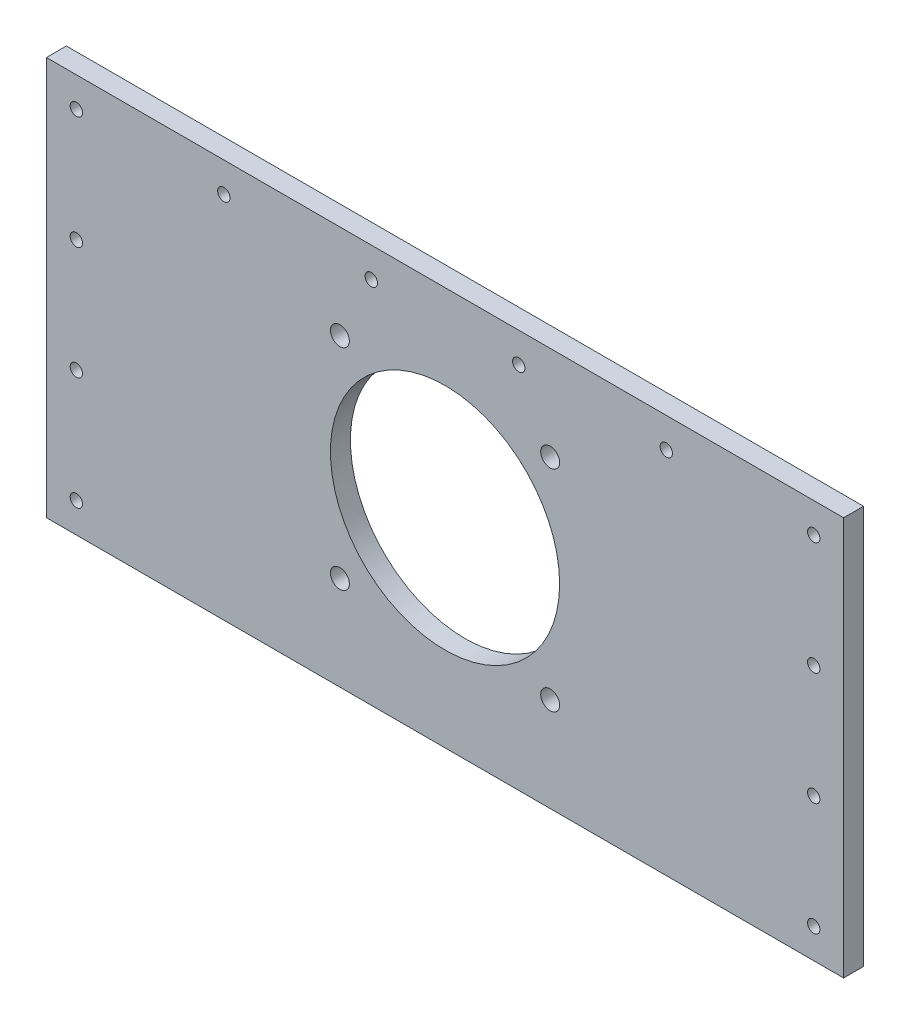
ISO-10303-21;
HEADER;
FILE_DESCRIPTION(('STEP AP214'),'2;1');
FILE_NAME('part.step','',(''),(''),'','','');
FILE_SCHEMA(('AUTOMOTIVE_DESIGN { 1 0 10303 214 1 1 1 1 }'));
ENDSEC;
DATA;
#1=APPLICATION_CONTEXT('core data for automotive mechanical design processes');
#2=APPLICATION_PROTOCOL_DEFINITION('international standard','automotive_design',2000,#1);
#3=PRODUCT_CONTEXT('',#1,'mechanical');
#4=PRODUCT('Part','Part','',(#3));
#5=PRODUCT_RELATED_PRODUCT_CATEGORY('part','',(#4));
#6=PRODUCT_DEFINITION_FORMATION('','',#4);
#7=PRODUCT_DEFINITION_CONTEXT('part definition',#1,'design');
#8=PRODUCT_DEFINITION('design','',#6,#7);
#9=PRODUCT_DEFINITION_SHAPE('','',#8);
#10=(LENGTH_UNIT() NAMED_UNIT(*) SI_UNIT(.MILLI.,.METRE.));
#11=(NAMED_UNIT(*) PLANE_ANGLE_UNIT() SI_UNIT($,.RADIAN.));
#12=(NAMED_UNIT(*) SI_UNIT($,.STERADIAN.) SOLID_ANGLE_UNIT());
#13=UNCERTAINTY_MEASURE_WITH_UNIT(LENGTH_MEASURE(1.E-05),#10,'distance_accuracy_value','');
#14=(GEOMETRIC_REPRESENTATION_CONTEXT(3) GLOBAL_UNCERTAINTY_ASSIGNED_CONTEXT((#13)) GLOBAL_UNIT_ASSIGNED_CONTEXT((#10,
#11,#12)) REPRESENTATION_CONTEXT('',''));
#15=CARTESIAN_POINT('',(0.,0.,0.));
#16=DIRECTION('',(0.,0.,1.));
#17=DIRECTION('',(1.,0.,0.));
#18=AXIS2_PLACEMENT_3D('',#15,#16,#17);
#19=CARTESIAN_POINT('',(0.,0.,10.));
#20=DIRECTION('',(0.,0.,-1.));
#21=DIRECTION('',(-1.,0.,0.));
#22=AXIS2_PLACEMENT_3D('',#19,#20,#21);
#23=PLANE('',#22);
#24=CARTESIAN_POINT('',(111.,85.,10.));
#25=DIRECTION('',(0.,0.,1.));
#26=DIRECTION('',(1.,0.,0.));
#27=AXIS2_PLACEMENT_3D('',#24,#25,#26);
#28=CIRCLE('',#27,3.09999999999999);
#29=CARTESIAN_POINT('',(114.1,85.,10.));
#30=VERTEX_POINT('',#29);
#31=EDGE_CURVE('E209',#30,#30,#28,.T.);
#32=ORIENTED_EDGE('',*,*,#31,.F.);
#33=EDGE_LOOP('',(#32));
#34=FACE_BOUND('',#33,.T.);
#35=CARTESIAN_POINT('',(36.9999999999999,85.,10.));
#36=DIRECTION('',(0.,0.,1.));
#37=DIRECTION('',(1.,0.,0.));
#38=AXIS2_PLACEMENT_3D('',#35,#36,#37);
#39=CIRCLE('',#38,3.09999999999999);
#40=CARTESIAN_POINT('',(40.0999999999999,85.,10.));
#41=VERTEX_POINT('',#40);
#42=EDGE_CURVE('E203',#41,#41,#39,.T.);
#43=ORIENTED_EDGE('',*,*,#42,.F.);
#44=EDGE_LOOP('',(#43));
#45=FACE_BOUND('',#44,.T.);
#46=CARTESIAN_POINT('',(-37.0000000000001,85.,10.));
#47=DIRECTION('',(0.,0.,1.));
#48=DIRECTION('',(1.,0.,0.));
#49=AXIS2_PLACEMENT_3D('',#46,#47,#48);
#50=CIRCLE('',#49,3.09999999999999);
#51=CARTESIAN_POINT('',(-33.9000000000001,85.,10.));
#52=VERTEX_POINT('',#51);
#53=EDGE_CURVE('E197',#52,#52,#50,.T.);
#54=ORIENTED_EDGE('',*,*,#53,.F.);
#55=EDGE_LOOP('',(#54));
#56=FACE_BOUND('',#55,.T.);
#57=CARTESIAN_POINT('',(-111.,85.,10.));
#58=DIRECTION('',(0.,0.,1.));
#59=DIRECTION('',(1.,0.,0.));
#60=AXIS2_PLACEMENT_3D('',#57,#58,#59);
#61=CIRCLE('',#60,3.09999999999999);
#62=CARTESIAN_POINT('',(-107.9,85.,10.));
#63=VERTEX_POINT('',#62);
#64=EDGE_CURVE('E191',#63,#63,#61,.T.);
#65=ORIENTED_EDGE('',*,*,#64,.F.);
#66=EDGE_LOOP('',(#65));
#67=FACE_BOUND('',#66,.T.);
#68=CARTESIAN_POINT('',(185.,85.,10.));
#69=DIRECTION('',(0.,0.,1.));
#70=DIRECTION('',(-1.,0.,0.));
#71=AXIS2_PLACEMENT_3D('',#68,#69,#70);
#72=CIRCLE('',#71,3.09999999999999);
#73=CARTESIAN_POINT('',(181.9,85.,10.));
#74=VERTEX_POINT('',#73);
#75=EDGE_CURVE('E185',#74,#74,#72,.T.);
#76=ORIENTED_EDGE('',*,*,#75,.F.);
#77=EDGE_LOOP('',(#76));
#78=FACE_BOUND('',#77,.T.);
#79=CARTESIAN_POINT('',(185.,28.3333333333334,10.));
#80=DIRECTION('',(0.,0.,1.));
#81=DIRECTION('',(-1.,0.,0.));
#82=AXIS2_PLACEMENT_3D('',#79,#80,#81);
#83=CIRCLE('',#82,3.09999999999999);
#84=CARTESIAN_POINT('',(181.9,28.3333333333334,10.));
#85=VERTEX_POINT('',#84);
#86=EDGE_CURVE('E179',#85,#85,#83,.T.);
#87=ORIENTED_EDGE('',*,*,#86,.F.);
#88=EDGE_LOOP('',(#87));
#89=FACE_BOUND('',#88,.T.);
#90=CARTESIAN_POINT('',(185.,-85.,10.));
#91=DIRECTION('',(0.,0.,1.));
#92=DIRECTION('',(-1.,0.,0.));
#93=AXIS2_PLACEMENT_3D('',#90,#91,#92);
#94=CIRCLE('',#93,3.09999999999999);
#95=CARTESIAN_POINT('',(181.9,-85.,10.));
#96=VERTEX_POINT('',#95);
#97=EDGE_CURVE('E173',#96,#96,#94,.T.);
#98=ORIENTED_EDGE('',*,*,#97,.F.);
#99=EDGE_LOOP('',(#98));
#100=FACE_BOUND('',#99,.T.);
#101=CARTESIAN_POINT('',(185.,-28.3333333333333,10.));
#102=DIRECTION('',(0.,0.,1.));
#103=DIRECTION('',(-1.,0.,0.));
#104=AXIS2_PLACEMENT_3D('',#101,#102,#103);
#105=CIRCLE('',#104,3.09999999999999);
#106=CARTESIAN_POINT('',(181.9,-28.3333333333333,10.));
#107=VERTEX_POINT('',#106);
#108=EDGE_CURVE('E167',#107,#107,#105,.T.);
#109=ORIENTED_EDGE('',*,*,#108,.F.);
#110=EDGE_LOOP('',(#109));
#111=FACE_BOUND('',#110,.T.);
#112=CARTESIAN_POINT('',(-185.,-28.3333333333333,10.));
#113=DIRECTION('',(0.,0.,1.));
#114=DIRECTION('',(1.,0.,0.));
#115=AXIS2_PLACEMENT_3D('',#112,#113,#114);
#116=CIRCLE('',#115,3.09999999999999);
#117=CARTESIAN_POINT('',(-181.9,-28.3333333333333,10.));
#118=VERTEX_POINT('',#117);
#119=EDGE_CURVE('E161',#118,#118,#116,.T.);
#120=ORIENTED_EDGE('',*,*,#119,.F.);
#121=EDGE_LOOP('',(#120));
#122=FACE_BOUND('',#121,.T.);
#123=CARTESIAN_POINT('',(-185.,-85.,10.));
#124=DIRECTION('',(0.,0.,1.));
#125=DIRECTION('',(1.,0.,0.));
#126=AXIS2_PLACEMENT_3D('',#123,#124,#125);
#127=CIRCLE('',#126,3.09999999999999);
#128=CARTESIAN_POINT('',(-181.9,-85.,10.));
#129=VERTEX_POINT('',#128);
#130=EDGE_CURVE('E155',#129,#129,#127,.T.);
#131=ORIENTED_EDGE('',*,*,#130,.F.);
#132=EDGE_LOOP('',(#131));
#133=FACE_BOUND('',#132,.T.);
#134=CARTESIAN_POINT('',(-185.,28.3333333333334,10.));
#135=DIRECTION('',(0.,0.,1.));
#136=DIRECTION('',(1.,0.,0.));
#137=AXIS2_PLACEMENT_3D('',#134,#135,#136);
#138=CIRCLE('',#137,3.09999999999999);
#139=CARTESIAN_POINT('',(-181.9,28.3333333333334,10.));
#140=VERTEX_POINT('',#139);
#141=EDGE_CURVE('E149',#140,#140,#138,.T.);
#142=ORIENTED_EDGE('',*,*,#141,.F.);
#143=EDGE_LOOP('',(#142));
#144=FACE_BOUND('',#143,.T.);
#145=CARTESIAN_POINT('',(-185.,85.,10.));
#146=DIRECTION('',(0.,0.,1.));
#147=DIRECTION('',(1.,0.,0.));
#148=AXIS2_PLACEMENT_3D('',#145,#146,#147);
#149=CIRCLE('',#148,3.09999999999999);
#150=CARTESIAN_POINT('',(-181.9,85.,10.));
#151=VERTEX_POINT('',#150);
#152=EDGE_CURVE('E143',#151,#151,#149,.T.);
#153=ORIENTED_EDGE('',*,*,#152,.F.);
#154=EDGE_LOOP('',(#153));
#155=FACE_BOUND('',#154,.T.);
#156=CARTESIAN_POINT('',(-52.7572369443283,-52.7572369443283,10.));
#157=DIRECTION('',(0.,0.,1.));
#158=DIRECTION('',(1.,0.,0.));
#159=AXIS2_PLACEMENT_3D('',#156,#157,#158);
#160=CIRCLE('',#159,4.75);
#161=CARTESIAN_POINT('',(-48.0072369443283,-52.7572369443283,10.));
#162=VERTEX_POINT('',#161);
#163=EDGE_CURVE('E128',#162,#162,#160,.T.);
#164=ORIENTED_EDGE('',*,*,#163,.F.);
#165=EDGE_LOOP('',(#164));
#166=FACE_BOUND('',#165,.T.);
#167=CARTESIAN_POINT('',(52.7572369443283,52.7572369443283,10.));
#168=DIRECTION('',(0.,0.,1.));
#169=DIRECTION('',(1.,0.,0.));
#170=AXIS2_PLACEMENT_3D('',#167,#168,#169);
#171=CIRCLE('',#170,4.75);
#172=CARTESIAN_POINT('',(57.5072369443283,52.7572369443283,10.));
#173=VERTEX_POINT('',#172);
#174=EDGE_CURVE('E116',#173,#173,#171,.T.);
#175=ORIENTED_EDGE('',*,*,#174,.F.);
#176=EDGE_LOOP('',(#175));
#177=FACE_BOUND('',#176,.T.);
#178=DIRECTION('',(0.,1.,0.));
#179=VECTOR('',#178,1.);
#180=CARTESIAN_POINT('',(200.,-100.,10.));
#181=LINE('',#180,#179);
#182=CARTESIAN_POINT('',(200.,-100.,10.));
#183=VERTEX_POINT('',#182);
#184=CARTESIAN_POINT('',(200.,100.,10.));
#185=VERTEX_POINT('',#184);
#186=EDGE_CURVE('E86',#183,#185,#181,.T.);
#187=ORIENTED_EDGE('',*,*,#186,.T.);
#188=DIRECTION('',(-1.,0.,0.));
#189=VECTOR('',#188,1.);
#190=CARTESIAN_POINT('',(-200.,100.,10.));
#191=LINE('',#190,#189);
#192=CARTESIAN_POINT('',(-200.,100.,10.));
#193=VERTEX_POINT('',#192);
#194=EDGE_CURVE('E81',#185,#193,#191,.T.);
#195=ORIENTED_EDGE('',*,*,#194,.T.);
#196=DIRECTION('',(0.,-1.,0.));
#197=VECTOR('',#196,1.);
#198=CARTESIAN_POINT('',(-200.,-100.,10.));
#199=LINE('',#198,#197);
#200=CARTESIAN_POINT('',(-200.,-100.,10.));
#201=VERTEX_POINT('',#200);
#202=EDGE_CURVE('E84',#193,#201,#199,.T.);
#203=ORIENTED_EDGE('',*,*,#202,.T.);
#204=DIRECTION('',(1.,0.,0.));
#205=VECTOR('',#204,1.);
#206=CARTESIAN_POINT('',(-200.,-100.,10.));
#207=LINE('',#206,#205);
#208=EDGE_CURVE('E51',#201,#183,#207,.T.);
#209=ORIENTED_EDGE('',*,*,#208,.T.);
#210=EDGE_LOOP('',(#187,#195,#203,#209));
#211=FACE_BOUND('',#210,.T.);
#212=CARTESIAN_POINT('',(-52.7572369443283,52.7572369443283,10.));
#213=DIRECTION('',(0.,0.,1.));
#214=DIRECTION('',(1.,0.,0.));
#215=AXIS2_PLACEMENT_3D('',#212,#213,#214);
#216=CIRCLE('',#215,4.75);
#217=CARTESIAN_POINT('',(-48.0072369443283,52.7572369443283,10.));
#218=VERTEX_POINT('',#217);
#219=EDGE_CURVE('E101',#218,#218,#216,.T.);
#220=ORIENTED_EDGE('',*,*,#219,.F.);
#221=EDGE_LOOP('',(#220));
#222=FACE_BOUND('',#221,.T.);
#223=CARTESIAN_POINT('',(52.7572369443283,-52.7572369443283,10.));
#224=DIRECTION('',(0.,0.,1.));
#225=DIRECTION('',(1.,0.,0.));
#226=AXIS2_PLACEMENT_3D('',#223,#224,#225);
#227=CIRCLE('',#226,4.75);
#228=CARTESIAN_POINT('',(57.5072369443283,-52.7572369443283,10.));
#229=VERTEX_POINT('',#228);
#230=EDGE_CURVE('E122',#229,#229,#227,.T.);
#231=ORIENTED_EDGE('',*,*,#230,.F.);
#232=EDGE_LOOP('',(#231));
#233=FACE_BOUND('',#232,.T.);
#234=CARTESIAN_POINT('',(0.,0.,10.));
#235=DIRECTION('',(0.,0.,1.));
#236=DIRECTION('',(1.,0.,0.));
#237=AXIS2_PLACEMENT_3D('',#234,#235,#236);
#238=CIRCLE('',#237,57.5);
#239=CARTESIAN_POINT('',(57.5,0.,10.));
#240=VERTEX_POINT('',#239);
#241=EDGE_CURVE('E134',#240,#240,#238,.T.);
#242=ORIENTED_EDGE('',*,*,#241,.F.);
#243=EDGE_LOOP('',(#242));
#244=FACE_BOUND('',#243,.T.);
#245=ADVANCED_FACE('F34',(#34,#45,#56,#67,#78,#89,#100,#111,#122,#133,#144,#155,#166,#177,#211,
#222,#233,#244),#23,.F.);
#246=CARTESIAN_POINT('',(0.,0.,0.));
#247=DIRECTION('',(0.,0.,-1.));
#248=DIRECTION('',(-1.,0.,0.));
#249=AXIS2_PLACEMENT_3D('',#246,#247,#248);
#250=PLANE('',#249);
#251=CARTESIAN_POINT('',(111.,85.,0.));
#252=DIRECTION('',(0.,0.,1.));
#253=DIRECTION('',(1.,0.,0.));
#254=AXIS2_PLACEMENT_3D('',#251,#252,#253);
#255=CIRCLE('',#254,3.09999999999999);
#256=CARTESIAN_POINT('',(114.1,85.,0.));
#257=VERTEX_POINT('',#256);
#258=EDGE_CURVE('E206',#257,#257,#255,.T.);
#259=ORIENTED_EDGE('',*,*,#258,.T.);
#260=EDGE_LOOP('',(#259));
#261=FACE_BOUND('',#260,.T.);
#262=CARTESIAN_POINT('',(36.9999999999999,85.,0.));
#263=DIRECTION('',(0.,0.,1.));
#264=DIRECTION('',(1.,0.,0.));
#265=AXIS2_PLACEMENT_3D('',#262,#263,#264);
#266=CIRCLE('',#265,3.09999999999999);
#267=CARTESIAN_POINT('',(40.0999999999999,85.,0.));
#268=VERTEX_POINT('',#267);
#269=EDGE_CURVE('E200',#268,#268,#266,.T.);
#270=ORIENTED_EDGE('',*,*,#269,.T.);
#271=EDGE_LOOP('',(#270));
#272=FACE_BOUND('',#271,.T.);
#273=CARTESIAN_POINT('',(-37.0000000000001,85.,0.));
#274=DIRECTION('',(0.,0.,1.));
#275=DIRECTION('',(1.,0.,0.));
#276=AXIS2_PLACEMENT_3D('',#273,#274,#275);
#277=CIRCLE('',#276,3.09999999999999);
#278=CARTESIAN_POINT('',(-33.9000000000001,85.,0.));
#279=VERTEX_POINT('',#278);
#280=EDGE_CURVE('E194',#279,#279,#277,.T.);
#281=ORIENTED_EDGE('',*,*,#280,.T.);
#282=EDGE_LOOP('',(#281));
#283=FACE_BOUND('',#282,.T.);
#284=CARTESIAN_POINT('',(-111.,85.,0.));
#285=DIRECTION('',(0.,0.,1.));
#286=DIRECTION('',(1.,0.,0.));
#287=AXIS2_PLACEMENT_3D('',#284,#285,#286);
#288=CIRCLE('',#287,3.09999999999999);
#289=CARTESIAN_POINT('',(-107.9,85.,0.));
#290=VERTEX_POINT('',#289);
#291=EDGE_CURVE('E188',#290,#290,#288,.T.);
#292=ORIENTED_EDGE('',*,*,#291,.T.);
#293=EDGE_LOOP('',(#292));
#294=FACE_BOUND('',#293,.T.);
#295=CARTESIAN_POINT('',(185.,85.,0.));
#296=DIRECTION('',(0.,0.,1.));
#297=DIRECTION('',(-1.,0.,0.));
#298=AXIS2_PLACEMENT_3D('',#295,#296,#297);
#299=CIRCLE('',#298,3.09999999999999);
#300=CARTESIAN_POINT('',(181.9,85.,0.));
#301=VERTEX_POINT('',#300);
#302=EDGE_CURVE('E182',#301,#301,#299,.T.);
#303=ORIENTED_EDGE('',*,*,#302,.T.);
#304=EDGE_LOOP('',(#303));
#305=FACE_BOUND('',#304,.T.);
#306=CARTESIAN_POINT('',(185.,28.3333333333334,0.));
#307=DIRECTION('',(0.,0.,1.));
#308=DIRECTION('',(-1.,0.,0.));
#309=AXIS2_PLACEMENT_3D('',#306,#307,#308);
#310=CIRCLE('',#309,3.09999999999999);
#311=CARTESIAN_POINT('',(181.9,28.3333333333334,0.));
#312=VERTEX_POINT('',#311);
#313=EDGE_CURVE('E176',#312,#312,#310,.T.);
#314=ORIENTED_EDGE('',*,*,#313,.T.);
#315=EDGE_LOOP('',(#314));
#316=FACE_BOUND('',#315,.T.);
#317=CARTESIAN_POINT('',(185.,-85.,0.));
#318=DIRECTION('',(0.,0.,1.));
#319=DIRECTION('',(-1.,0.,0.));
#320=AXIS2_PLACEMENT_3D('',#317,#318,#319);
#321=CIRCLE('',#320,3.09999999999999);
#322=CARTESIAN_POINT('',(181.9,-85.,0.));
#323=VERTEX_POINT('',#322);
#324=EDGE_CURVE('E170',#323,#323,#321,.T.);
#325=ORIENTED_EDGE('',*,*,#324,.T.);
#326=EDGE_LOOP('',(#325));
#327=FACE_BOUND('',#326,.T.);
#328=CARTESIAN_POINT('',(185.,-28.3333333333333,0.));
#329=DIRECTION('',(0.,0.,1.));
#330=DIRECTION('',(-1.,0.,0.));
#331=AXIS2_PLACEMENT_3D('',#328,#329,#330);
#332=CIRCLE('',#331,3.09999999999999);
#333=CARTESIAN_POINT('',(181.9,-28.3333333333333,0.));
#334=VERTEX_POINT('',#333);
#335=EDGE_CURVE('E164',#334,#334,#332,.T.);
#336=ORIENTED_EDGE('',*,*,#335,.T.);
#337=EDGE_LOOP('',(#336));
#338=FACE_BOUND('',#337,.T.);
#339=CARTESIAN_POINT('',(-185.,-28.3333333333333,0.));
#340=DIRECTION('',(0.,0.,1.));
#341=DIRECTION('',(1.,0.,0.));
#342=AXIS2_PLACEMENT_3D('',#339,#340,#341);
#343=CIRCLE('',#342,3.09999999999999);
#344=CARTESIAN_POINT('',(-181.9,-28.3333333333333,0.));
#345=VERTEX_POINT('',#344);
#346=EDGE_CURVE('E158',#345,#345,#343,.T.);
#347=ORIENTED_EDGE('',*,*,#346,.T.);
#348=EDGE_LOOP('',(#347));
#349=FACE_BOUND('',#348,.T.);
#350=CARTESIAN_POINT('',(-185.,-85.,0.));
#351=DIRECTION('',(0.,0.,1.));
#352=DIRECTION('',(1.,0.,0.));
#353=AXIS2_PLACEMENT_3D('',#350,#351,#352);
#354=CIRCLE('',#353,3.09999999999999);
#355=CARTESIAN_POINT('',(-181.9,-85.,0.));
#356=VERTEX_POINT('',#355);
#357=EDGE_CURVE('E152',#356,#356,#354,.T.);
#358=ORIENTED_EDGE('',*,*,#357,.T.);
#359=EDGE_LOOP('',(#358));
#360=FACE_BOUND('',#359,.T.);
#361=CARTESIAN_POINT('',(-185.,28.3333333333334,0.));
#362=DIRECTION('',(0.,0.,1.));
#363=DIRECTION('',(1.,0.,0.));
#364=AXIS2_PLACEMENT_3D('',#361,#362,#363);
#365=CIRCLE('',#364,3.09999999999999);
#366=CARTESIAN_POINT('',(-181.9,28.3333333333334,0.));
#367=VERTEX_POINT('',#366);
#368=EDGE_CURVE('E146',#367,#367,#365,.T.);
#369=ORIENTED_EDGE('',*,*,#368,.T.);
#370=EDGE_LOOP('',(#369));
#371=FACE_BOUND('',#370,.T.);
#372=CARTESIAN_POINT('',(-185.,85.,0.));
#373=DIRECTION('',(0.,0.,1.));
#374=DIRECTION('',(1.,0.,0.));
#375=AXIS2_PLACEMENT_3D('',#372,#373,#374);
#376=CIRCLE('',#375,3.09999999999999);
#377=CARTESIAN_POINT('',(-181.9,85.,0.));
#378=VERTEX_POINT('',#377);
#379=EDGE_CURVE('E140',#378,#378,#376,.T.);
#380=ORIENTED_EDGE('',*,*,#379,.T.);
#381=EDGE_LOOP('',(#380));
#382=FACE_BOUND('',#381,.T.);
#383=CARTESIAN_POINT('',(-52.7572369443283,-52.7572369443283,0.));
#384=DIRECTION('',(0.,0.,1.));
#385=DIRECTION('',(1.,0.,0.));
#386=AXIS2_PLACEMENT_3D('',#383,#384,#385);
#387=CIRCLE('',#386,4.75);
#388=CARTESIAN_POINT('',(-48.0072369443283,-52.7572369443283,0.));
#389=VERTEX_POINT('',#388);
#390=EDGE_CURVE('E131',#389,#389,#387,.T.);
#391=ORIENTED_EDGE('',*,*,#390,.T.);
#392=EDGE_LOOP('',(#391));
#393=FACE_BOUND('',#392,.T.);
#394=CARTESIAN_POINT('',(52.7572369443283,52.7572369443283,0.));
#395=DIRECTION('',(0.,0.,1.));
#396=DIRECTION('',(1.,0.,0.));
#397=AXIS2_PLACEMENT_3D('',#394,#395,#396);
#398=CIRCLE('',#397,4.75);
#399=CARTESIAN_POINT('',(57.5072369443283,52.7572369443283,0.));
#400=VERTEX_POINT('',#399);
#401=EDGE_CURVE('E119',#400,#400,#398,.T.);
#402=ORIENTED_EDGE('',*,*,#401,.T.);
#403=EDGE_LOOP('',(#402));
#404=FACE_BOUND('',#403,.T.);
#405=DIRECTION('',(0.,1.,0.));
#406=VECTOR('',#405,1.);
#407=CARTESIAN_POINT('',(200.,-100.,0.));
#408=LINE('',#407,#406);
#409=CARTESIAN_POINT('',(200.,-100.,0.));
#410=VERTEX_POINT('',#409);
#411=CARTESIAN_POINT('',(200.,100.,0.));
#412=VERTEX_POINT('',#411);
#413=EDGE_CURVE('E98',#410,#412,#408,.T.);
#414=ORIENTED_EDGE('',*,*,#413,.F.);
#415=DIRECTION('',(1.,0.,0.));
#416=VECTOR('',#415,1.);
#417=CARTESIAN_POINT('',(-200.,-100.,0.));
#418=LINE('',#417,#416);
#419=CARTESIAN_POINT('',(-200.,-100.,0.));
#420=VERTEX_POINT('',#419);
#421=EDGE_CURVE('E74',#420,#410,#418,.T.);
#422=ORIENTED_EDGE('',*,*,#421,.F.);
#423=DIRECTION('',(0.,-1.,0.));
#424=VECTOR('',#423,1.);
#425=CARTESIAN_POINT('',(-200.,-100.,0.));
#426=LINE('',#425,#424);
#427=CARTESIAN_POINT('',(-200.,100.,0.));
#428=VERTEX_POINT('',#427);
#429=EDGE_CURVE('E68',#428,#420,#426,.T.);
#430=ORIENTED_EDGE('',*,*,#429,.F.);
#431=DIRECTION('',(-1.,0.,0.));
#432=VECTOR('',#431,1.);
#433=CARTESIAN_POINT('',(-200.,100.,0.));
#434=LINE('',#433,#432);
#435=EDGE_CURVE('E90',#412,#428,#434,.T.);
#436=ORIENTED_EDGE('',*,*,#435,.F.);
#437=EDGE_LOOP('',(#414,#422,#430,#436));
#438=FACE_BOUND('',#437,.T.);
#439=CARTESIAN_POINT('',(-52.7572369443283,52.7572369443283,0.));
#440=DIRECTION('',(0.,0.,1.));
#441=DIRECTION('',(1.,0.,0.));
#442=AXIS2_PLACEMENT_3D('',#439,#440,#441);
#443=CIRCLE('',#442,4.75);
#444=CARTESIAN_POINT('',(-48.0072369443283,52.7572369443283,0.));
#445=VERTEX_POINT('',#444);
#446=EDGE_CURVE('E113',#445,#445,#443,.T.);
#447=ORIENTED_EDGE('',*,*,#446,.T.);
#448=EDGE_LOOP('',(#447));
#449=FACE_BOUND('',#448,.T.);
#450=CARTESIAN_POINT('',(52.7572369443283,-52.7572369443283,0.));
#451=DIRECTION('',(0.,0.,1.));
#452=DIRECTION('',(1.,0.,0.));
#453=AXIS2_PLACEMENT_3D('',#450,#451,#452);
#454=CIRCLE('',#453,4.75);
#455=CARTESIAN_POINT('',(57.5072369443283,-52.7572369443283,0.));
#456=VERTEX_POINT('',#455);
#457=EDGE_CURVE('E125',#456,#456,#454,.T.);
#458=ORIENTED_EDGE('',*,*,#457,.T.);
#459=EDGE_LOOP('',(#458));
#460=FACE_BOUND('',#459,.T.);
#461=CARTESIAN_POINT('',(0.,0.,0.));
#462=DIRECTION('',(0.,0.,1.));
#463=DIRECTION('',(1.,0.,0.));
#464=AXIS2_PLACEMENT_3D('',#461,#462,#463);
#465=CIRCLE('',#464,57.5);
#466=CARTESIAN_POINT('',(57.5,0.,0.));
#467=VERTEX_POINT('',#466);
#468=EDGE_CURVE('E137',#467,#467,#465,.T.);
#469=ORIENTED_EDGE('',*,*,#468,.T.);
#470=EDGE_LOOP('',(#469));
#471=FACE_BOUND('',#470,.T.);
#472=ADVANCED_FACE('F109',(#261,#272,#283,#294,#305,#316,#327,#338,#349,#360,#371,#382,#393,
#404,#438,#449,#460,#471),#250,.T.);
#473=CARTESIAN_POINT('',(200.,-100.,10.));
#474=DIRECTION('',(-1.,0.,0.));
#475=DIRECTION('',(0.,0.,1.));
#476=AXIS2_PLACEMENT_3D('',#473,#474,#475);
#477=PLANE('',#476);
#478=ORIENTED_EDGE('',*,*,#413,.T.);
#479=DIRECTION('',(0.,0.,-1.));
#480=VECTOR('',#479,1.);
#481=CARTESIAN_POINT('',(200.,100.,10.));
#482=LINE('',#481,#480);
#483=EDGE_CURVE('E11',#185,#412,#482,.T.);
#484=ORIENTED_EDGE('',*,*,#483,.F.);
#485=ORIENTED_EDGE('',*,*,#186,.F.);
#486=DIRECTION('',(0.,0.,-1.));
#487=VECTOR('',#486,1.);
#488=CARTESIAN_POINT('',(200.,-100.,10.));
#489=LINE('',#488,#487);
#490=EDGE_CURVE('E94',#183,#410,#489,.T.);
#491=ORIENTED_EDGE('',*,*,#490,.T.);
#492=EDGE_LOOP('',(#478,#484,#485,#491));
#493=FACE_BOUND('',#492,.T.);
#494=ADVANCED_FACE('F36',(#493),#477,.F.);
#495=CARTESIAN_POINT('',(-200.,100.,10.));
#496=DIRECTION('',(0.,-1.,0.));
#497=DIRECTION('',(0.,0.,-1.));
#498=AXIS2_PLACEMENT_3D('',#495,#496,#497);
#499=PLANE('',#498);
#500=ORIENTED_EDGE('',*,*,#435,.T.);
#501=DIRECTION('',(0.,0.,-1.));
#502=VECTOR('',#501,1.);
#503=CARTESIAN_POINT('',(-200.,100.,10.));
#504=LINE('',#503,#502);
#505=EDGE_CURVE('E43',#193,#428,#504,.T.);
#506=ORIENTED_EDGE('',*,*,#505,.F.);
#507=ORIENTED_EDGE('',*,*,#194,.F.);
#508=ORIENTED_EDGE('',*,*,#483,.T.);
#509=EDGE_LOOP('',(#500,#506,#507,#508));
#510=FACE_BOUND('',#509,.T.);
#511=ADVANCED_FACE('F89',(#510),#499,.F.);
#512=CARTESIAN_POINT('',(-200.,-100.,10.));
#513=DIRECTION('',(1.,0.,0.));
#514=DIRECTION('',(0.,0.,-1.));
#515=AXIS2_PLACEMENT_3D('',#512,#513,#514);
#516=PLANE('',#515);
#517=ORIENTED_EDGE('',*,*,#429,.T.);
#518=DIRECTION('',(0.,0.,-1.));
#519=VECTOR('',#518,1.);
#520=CARTESIAN_POINT('',(-200.,-100.,10.));
#521=LINE('',#520,#519);
#522=EDGE_CURVE('E91',#201,#420,#521,.T.);
#523=ORIENTED_EDGE('',*,*,#522,.F.);
#524=ORIENTED_EDGE('',*,*,#202,.F.);
#525=ORIENTED_EDGE('',*,*,#505,.T.);
#526=EDGE_LOOP('',(#517,#523,#524,#525));
#527=FACE_BOUND('',#526,.T.);
#528=ADVANCED_FACE('F92',(#527),#516,.F.);
#529=CARTESIAN_POINT('',(-200.,-100.,10.));
#530=DIRECTION('',(0.,1.,0.));
#531=DIRECTION('',(0.,0.,1.));
#532=AXIS2_PLACEMENT_3D('',#529,#530,#531);
#533=PLANE('',#532);
#534=ORIENTED_EDGE('',*,*,#421,.T.);
#535=ORIENTED_EDGE('',*,*,#490,.F.);
#536=ORIENTED_EDGE('',*,*,#208,.F.);
#537=ORIENTED_EDGE('',*,*,#522,.T.);
#538=EDGE_LOOP('',(#534,#535,#536,#537));
#539=FACE_BOUND('',#538,.T.);
#540=ADVANCED_FACE('F106',(#539),#533,.F.);
#541=CARTESIAN_POINT('',(-52.7572369443283,52.7572369443283,10.));
#542=DIRECTION('',(0.,0.,-1.));
#543=DIRECTION('',(-1.,0.,0.));
#544=AXIS2_PLACEMENT_3D('',#541,#542,#543);
#545=CYLINDRICAL_SURFACE('',#544,4.75);
#546=ORIENTED_EDGE('',*,*,#219,.T.);
#547=EDGE_LOOP('',(#546));
#548=FACE_BOUND('',#547,.T.);
#549=ORIENTED_EDGE('',*,*,#446,.F.);
#550=EDGE_LOOP('',(#549));
#551=FACE_BOUND('',#550,.T.);
#552=ADVANCED_FACE('F257',(#548,#551),#545,.F.);
#553=CARTESIAN_POINT('',(52.7572369443283,52.7572369443283,10.));
#554=DIRECTION('',(0.,0.,-1.));
#555=DIRECTION('',(-1.,0.,0.));
#556=AXIS2_PLACEMENT_3D('',#553,#554,#555);
#557=CYLINDRICAL_SURFACE('',#556,4.75);
#558=ORIENTED_EDGE('',*,*,#174,.T.);
#559=EDGE_LOOP('',(#558));
#560=FACE_BOUND('',#559,.T.);
#561=ORIENTED_EDGE('',*,*,#401,.F.);
#562=EDGE_LOOP('',(#561));
#563=FACE_BOUND('',#562,.T.);
#564=ADVANCED_FACE('F253',(#560,#563),#557,.F.);
#565=CARTESIAN_POINT('',(52.7572369443283,-52.7572369443283,10.));
#566=DIRECTION('',(0.,0.,-1.));
#567=DIRECTION('',(-1.,0.,0.));
#568=AXIS2_PLACEMENT_3D('',#565,#566,#567);
#569=CYLINDRICAL_SURFACE('',#568,4.75);
#570=ORIENTED_EDGE('',*,*,#230,.T.);
#571=EDGE_LOOP('',(#570));
#572=FACE_BOUND('',#571,.T.);
#573=ORIENTED_EDGE('',*,*,#457,.F.);
#574=EDGE_LOOP('',(#573));
#575=FACE_BOUND('',#574,.T.);
#576=ADVANCED_FACE('F256',(#572,#575),#569,.F.);
#577=CARTESIAN_POINT('',(-52.7572369443283,-52.7572369443283,10.));
#578=DIRECTION('',(0.,0.,-1.));
#579=DIRECTION('',(-1.,0.,0.));
#580=AXIS2_PLACEMENT_3D('',#577,#578,#579);
#581=CYLINDRICAL_SURFACE('',#580,4.75);
#582=ORIENTED_EDGE('',*,*,#163,.T.);
#583=EDGE_LOOP('',(#582));
#584=FACE_BOUND('',#583,.T.);
#585=ORIENTED_EDGE('',*,*,#390,.F.);
#586=EDGE_LOOP('',(#585));
#587=FACE_BOUND('',#586,.T.);
#588=ADVANCED_FACE('F300',(#584,#587),#581,.F.);
#589=CARTESIAN_POINT('',(0.,0.,10.));
#590=DIRECTION('',(0.,0.,-1.));
#591=DIRECTION('',(-1.,0.,0.));
#592=AXIS2_PLACEMENT_3D('',#589,#590,#591);
#593=CYLINDRICAL_SURFACE('',#592,57.5);
#594=ORIENTED_EDGE('',*,*,#241,.T.);
#595=EDGE_LOOP('',(#594));
#596=FACE_BOUND('',#595,.T.);
#597=ORIENTED_EDGE('',*,*,#468,.F.);
#598=EDGE_LOOP('',(#597));
#599=FACE_BOUND('',#598,.T.);
#600=ADVANCED_FACE('F308',(#596,#599),#593,.F.);
#601=CARTESIAN_POINT('',(-185.,85.,0.));
#602=DIRECTION('',(0.,0.,1.));
#603=DIRECTION('',(1.,0.,0.));
#604=AXIS2_PLACEMENT_3D('',#601,#602,#603);
#605=CYLINDRICAL_SURFACE('',#604,3.09999999999999);
#606=ORIENTED_EDGE('',*,*,#379,.F.);
#607=EDGE_LOOP('',(#606));
#608=FACE_BOUND('',#607,.T.);
#609=ORIENTED_EDGE('',*,*,#152,.T.);
#610=EDGE_LOOP('',(#609));
#611=FACE_BOUND('',#610,.T.);
#612=ADVANCED_FACE('F316',(#608,#611),#605,.F.);
#613=CARTESIAN_POINT('',(-185.,28.3333333333334,0.));
#614=DIRECTION('',(0.,0.,1.));
#615=DIRECTION('',(1.,0.,0.));
#616=AXIS2_PLACEMENT_3D('',#613,#614,#615);
#617=CYLINDRICAL_SURFACE('',#616,3.09999999999999);
#618=ORIENTED_EDGE('',*,*,#368,.F.);
#619=EDGE_LOOP('',(#618));
#620=FACE_BOUND('',#619,.T.);
#621=ORIENTED_EDGE('',*,*,#141,.T.);
#622=EDGE_LOOP('',(#621));
#623=FACE_BOUND('',#622,.T.);
#624=ADVANCED_FACE('F325',(#620,#623),#617,.F.);
#625=CARTESIAN_POINT('',(-185.,-85.,0.));
#626=DIRECTION('',(0.,0.,1.));
#627=DIRECTION('',(1.,0.,0.));
#628=AXIS2_PLACEMENT_3D('',#625,#626,#627);
#629=CYLINDRICAL_SURFACE('',#628,3.09999999999999);
#630=ORIENTED_EDGE('',*,*,#357,.F.);
#631=EDGE_LOOP('',(#630));
#632=FACE_BOUND('',#631,.T.);
#633=ORIENTED_EDGE('',*,*,#130,.T.);
#634=EDGE_LOOP('',(#633));
#635=FACE_BOUND('',#634,.T.);
#636=ADVANCED_FACE('F333',(#632,#635),#629,.F.);
#637=CARTESIAN_POINT('',(-185.,-28.3333333333333,0.));
#638=DIRECTION('',(0.,0.,1.));
#639=DIRECTION('',(1.,0.,0.));
#640=AXIS2_PLACEMENT_3D('',#637,#638,#639);
#641=CYLINDRICAL_SURFACE('',#640,3.09999999999999);
#642=ORIENTED_EDGE('',*,*,#346,.F.);
#643=EDGE_LOOP('',(#642));
#644=FACE_BOUND('',#643,.T.);
#645=ORIENTED_EDGE('',*,*,#119,.T.);
#646=EDGE_LOOP('',(#645));
#647=FACE_BOUND('',#646,.T.);
#648=ADVANCED_FACE('F341',(#644,#647),#641,.F.);
#649=CARTESIAN_POINT('',(185.,-28.3333333333333,0.));
#650=DIRECTION('',(0.,0.,1.));
#651=DIRECTION('',(1.,0.,0.));
#652=AXIS2_PLACEMENT_3D('',#649,#650,#651);
#653=CYLINDRICAL_SURFACE('',#652,3.09999999999999);
#654=ORIENTED_EDGE('',*,*,#335,.F.);
#655=EDGE_LOOP('',(#654));
#656=FACE_BOUND('',#655,.T.);
#657=ORIENTED_EDGE('',*,*,#108,.T.);
#658=EDGE_LOOP('',(#657));
#659=FACE_BOUND('',#658,.T.);
#660=ADVANCED_FACE('F349',(#656,#659),#653,.F.);
#661=CARTESIAN_POINT('',(185.,-85.,0.));
#662=DIRECTION('',(0.,0.,1.));
#663=DIRECTION('',(1.,0.,0.));
#664=AXIS2_PLACEMENT_3D('',#661,#662,#663);
#665=CYLINDRICAL_SURFACE('',#664,3.09999999999999);
#666=ORIENTED_EDGE('',*,*,#324,.F.);
#667=EDGE_LOOP('',(#666));
#668=FACE_BOUND('',#667,.T.);
#669=ORIENTED_EDGE('',*,*,#97,.T.);
#670=EDGE_LOOP('',(#669));
#671=FACE_BOUND('',#670,.T.);
#672=ADVANCED_FACE('F357',(#668,#671),#665,.F.);
#673=CARTESIAN_POINT('',(185.,28.3333333333334,0.));
#674=DIRECTION('',(0.,0.,1.));
#675=DIRECTION('',(1.,0.,0.));
#676=AXIS2_PLACEMENT_3D('',#673,#674,#675);
#677=CYLINDRICAL_SURFACE('',#676,3.09999999999999);
#678=ORIENTED_EDGE('',*,*,#313,.F.);
#679=EDGE_LOOP('',(#678));
#680=FACE_BOUND('',#679,.T.);
#681=ORIENTED_EDGE('',*,*,#86,.T.);
#682=EDGE_LOOP('',(#681));
#683=FACE_BOUND('',#682,.T.);
#684=ADVANCED_FACE('F365',(#680,#683),#677,.F.);
#685=CARTESIAN_POINT('',(185.,85.,0.));
#686=DIRECTION('',(0.,0.,1.));
#687=DIRECTION('',(1.,0.,0.));
#688=AXIS2_PLACEMENT_3D('',#685,#686,#687);
#689=CYLINDRICAL_SURFACE('',#688,3.09999999999999);
#690=ORIENTED_EDGE('',*,*,#302,.F.);
#691=EDGE_LOOP('',(#690));
#692=FACE_BOUND('',#691,.T.);
#693=ORIENTED_EDGE('',*,*,#75,.T.);
#694=EDGE_LOOP('',(#693));
#695=FACE_BOUND('',#694,.T.);
#696=ADVANCED_FACE('F373',(#692,#695),#689,.F.);
#697=CARTESIAN_POINT('',(-111.,85.,0.));
#698=DIRECTION('',(0.,0.,1.));
#699=DIRECTION('',(1.,0.,0.));
#700=AXIS2_PLACEMENT_3D('',#697,#698,#699);
#701=CYLINDRICAL_SURFACE('',#700,3.09999999999999);
#702=ORIENTED_EDGE('',*,*,#291,.F.);
#703=EDGE_LOOP('',(#702));
#704=FACE_BOUND('',#703,.T.);
#705=ORIENTED_EDGE('',*,*,#64,.T.);
#706=EDGE_LOOP('',(#705));
#707=FACE_BOUND('',#706,.T.);
#708=ADVANCED_FACE('F381',(#704,#707),#701,.F.);
#709=CARTESIAN_POINT('',(-37.0000000000001,85.,0.));
#710=DIRECTION('',(0.,0.,1.));
#711=DIRECTION('',(1.,0.,0.));
#712=AXIS2_PLACEMENT_3D('',#709,#710,#711);
#713=CYLINDRICAL_SURFACE('',#712,3.09999999999999);
#714=ORIENTED_EDGE('',*,*,#280,.F.);
#715=EDGE_LOOP('',(#714));
#716=FACE_BOUND('',#715,.T.);
#717=ORIENTED_EDGE('',*,*,#53,.T.);
#718=EDGE_LOOP('',(#717));
#719=FACE_BOUND('',#718,.T.);
#720=ADVANCED_FACE('F389',(#716,#719),#713,.F.);
#721=CARTESIAN_POINT('',(36.9999999999999,85.,0.));
#722=DIRECTION('',(0.,0.,1.));
#723=DIRECTION('',(1.,0.,0.));
#724=AXIS2_PLACEMENT_3D('',#721,#722,#723);
#725=CYLINDRICAL_SURFACE('',#724,3.09999999999999);
#726=ORIENTED_EDGE('',*,*,#269,.F.);
#727=EDGE_LOOP('',(#726));
#728=FACE_BOUND('',#727,.T.);
#729=ORIENTED_EDGE('',*,*,#42,.T.);
#730=EDGE_LOOP('',(#729));
#731=FACE_BOUND('',#730,.T.);
#732=ADVANCED_FACE('F220',(#728,#731),#725,.F.);
#733=CARTESIAN_POINT('',(111.,85.,0.));
#734=DIRECTION('',(0.,0.,1.));
#735=DIRECTION('',(1.,0.,0.));
#736=AXIS2_PLACEMENT_3D('',#733,#734,#735);
#737=CYLINDRICAL_SURFACE('',#736,3.09999999999999);
#738=ORIENTED_EDGE('',*,*,#258,.F.);
#739=EDGE_LOOP('',(#738));
#740=FACE_BOUND('',#739,.T.);
#741=ORIENTED_EDGE('',*,*,#31,.T.);
#742=EDGE_LOOP('',(#741));
#743=FACE_BOUND('',#742,.T.);
#744=ADVANCED_FACE('F217',(#740,#743),#737,.F.);
#745=CLOSED_SHELL('',(#245,#472,#494,#511,#528,#540,#552,#564,#576,#588,#600,#612,#624,#636,
#648,#660,#672,#684,#696,#708,#720,#732,#744));
#746=MANIFOLD_SOLID_BREP('B2',#745);
#747=ADVANCED_BREP_SHAPE_REPRESENTATION('',(#18,#746),#14);
#748=SHAPE_DEFINITION_REPRESENTATION(#9,#747);
ENDSEC;
END-ISO-10303-21;
